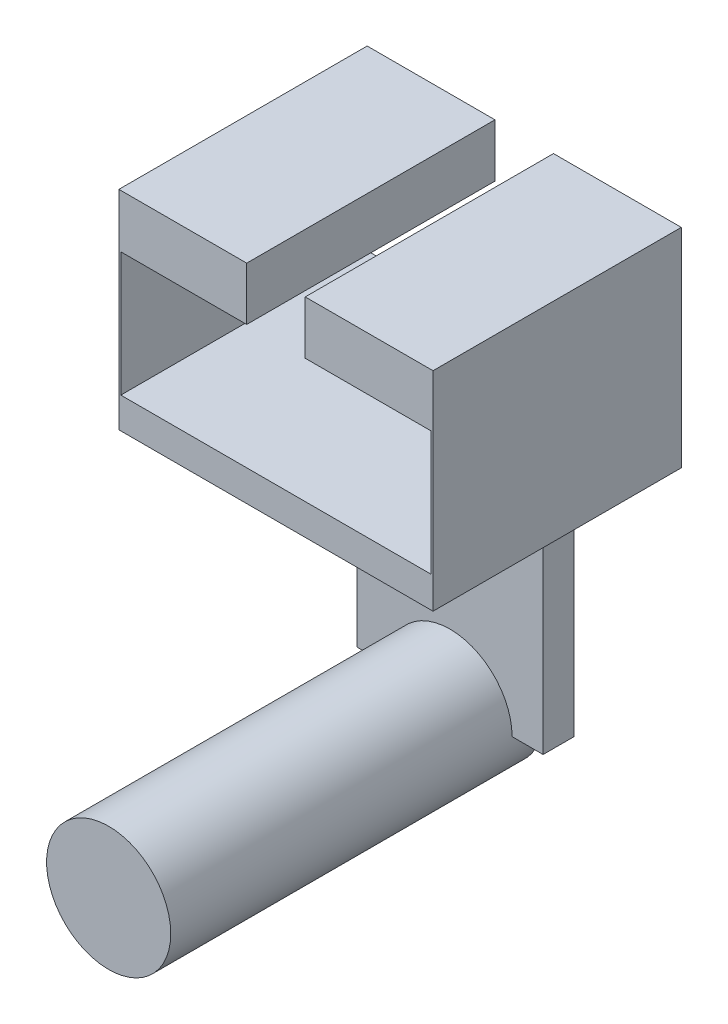
ISO-10303-21;
HEADER;
FILE_DESCRIPTION(('STEP AP214'),'2;1');
FILE_NAME('part.step','',(''),(''),'','','');
FILE_SCHEMA(('AUTOMOTIVE_DESIGN { 1 0 10303 214 1 1 1 1 }'));
ENDSEC;
DATA;
#1=APPLICATION_CONTEXT('core data for automotive mechanical design processes');
#2=APPLICATION_PROTOCOL_DEFINITION('international standard','automotive_design',2000,#1);
#3=PRODUCT_CONTEXT('',#1,'mechanical');
#4=PRODUCT('Part','Part','',(#3));
#5=PRODUCT_RELATED_PRODUCT_CATEGORY('part','',(#4));
#6=PRODUCT_DEFINITION_FORMATION('','',#4);
#7=PRODUCT_DEFINITION_CONTEXT('part definition',#1,'design');
#8=PRODUCT_DEFINITION('design','',#6,#7);
#9=PRODUCT_DEFINITION_SHAPE('','',#8);
#10=(LENGTH_UNIT() NAMED_UNIT(*) SI_UNIT(.MILLI.,.METRE.));
#11=(NAMED_UNIT(*) PLANE_ANGLE_UNIT() SI_UNIT($,.RADIAN.));
#12=(NAMED_UNIT(*) SI_UNIT($,.STERADIAN.) SOLID_ANGLE_UNIT());
#13=UNCERTAINTY_MEASURE_WITH_UNIT(LENGTH_MEASURE(1.E-05),#10,'distance_accuracy_value','');
#14=(GEOMETRIC_REPRESENTATION_CONTEXT(3) GLOBAL_UNCERTAINTY_ASSIGNED_CONTEXT((#13)) GLOBAL_UNIT_ASSIGNED_CONTEXT((#10,
#11,#12)) REPRESENTATION_CONTEXT('',''));
#15=CARTESIAN_POINT('',(0.,0.,0.));
#16=DIRECTION('',(0.,0.,1.));
#17=DIRECTION('',(1.,0.,0.));
#18=AXIS2_PLACEMENT_3D('',#15,#16,#17);
#19=CARTESIAN_POINT('',(32.7980582503673,82.55,-7.78651726081213));
#20=DIRECTION('',(1.,0.,0.));
#21=DIRECTION('',(0.,1.,0.));
#22=AXIS2_PLACEMENT_3D('',#19,#20,#21);
#23=PLANE('',#22);
#24=DIRECTION('',(0.,0.,1.));
#25=VECTOR('',#24,1.);
#26=CARTESIAN_POINT('',(32.7980582503673,82.55,-7.78651726081213));
#27=LINE('',#26,#25);
#28=CARTESIAN_POINT('',(32.7980582503673,82.55,-7.78651726081213));
#29=VERTEX_POINT('',#28);
#30=CARTESIAN_POINT('',(32.7980582503673,82.55,43.0134827391879));
#31=VERTEX_POINT('',#30);
#32=EDGE_CURVE('E62',#29,#31,#27,.T.);
#33=ORIENTED_EDGE('',*,*,#32,.F.);
#34=DIRECTION('',(0.,-1.,0.));
#35=VECTOR('',#34,1.);
#36=CARTESIAN_POINT('',(32.7980582503673,82.55,-7.78651726081213));
#37=LINE('',#36,#35);
#38=CARTESIAN_POINT('',(32.7980582503673,57.15,-7.78651726081213));
#39=VERTEX_POINT('',#38);
#40=EDGE_CURVE('E193',#29,#39,#37,.T.);
#41=ORIENTED_EDGE('',*,*,#40,.T.);
#42=DIRECTION('',(0.,0.,1.));
#43=VECTOR('',#42,1.);
#44=CARTESIAN_POINT('',(32.7980582503673,57.15,-7.78651726081213));
#45=LINE('',#44,#43);
#46=CARTESIAN_POINT('',(32.7980582503673,57.15,43.0134827391879));
#47=VERTEX_POINT('',#46);
#48=EDGE_CURVE('E269',#39,#47,#45,.T.);
#49=ORIENTED_EDGE('',*,*,#48,.T.);
#50=DIRECTION('',(0.,-1.,0.));
#51=VECTOR('',#50,1.);
#52=CARTESIAN_POINT('',(32.7980582503673,82.55,43.0134827391879));
#53=LINE('',#52,#51);
#54=EDGE_CURVE('E277',#31,#47,#53,.T.);
#55=ORIENTED_EDGE('',*,*,#54,.F.);
#56=EDGE_LOOP('',(#33,#41,#49,#55));
#57=FACE_BOUND('',#56,.T.);
#58=ADVANCED_FACE('F44',(#57),#23,.F.);
#59=CARTESIAN_POINT('',(-30.7019417496327,82.55,-7.78651726081213));
#60=DIRECTION('',(-1.,0.,0.));
#61=DIRECTION('',(0.,-1.,0.));
#62=AXIS2_PLACEMENT_3D('',#59,#60,#61);
#63=PLANE('',#62);
#64=DIRECTION('',(0.,0.,-1.));
#65=VECTOR('',#64,1.);
#66=CARTESIAN_POINT('',(-30.7019417496326,82.55,43.0134827391879));
#67=LINE('',#66,#65);
#68=CARTESIAN_POINT('',(-30.7019417496326,82.55,43.0134827391879));
#69=VERTEX_POINT('',#68);
#70=CARTESIAN_POINT('',(-30.7019417496327,82.55,-7.78651726081213));
#71=VERTEX_POINT('',#70);
#72=EDGE_CURVE('E66',#69,#71,#67,.T.);
#73=ORIENTED_EDGE('',*,*,#72,.F.);
#74=DIRECTION('',(0.,-1.,0.));
#75=VECTOR('',#74,1.);
#76=CARTESIAN_POINT('',(-30.7019417496326,82.55,43.0134827391879));
#77=LINE('',#76,#75);
#78=CARTESIAN_POINT('',(-30.7019417496326,57.15,43.0134827391879));
#79=VERTEX_POINT('',#78);
#80=EDGE_CURVE('E258',#69,#79,#77,.T.);
#81=ORIENTED_EDGE('',*,*,#80,.T.);
#82=DIRECTION('',(0.,0.,-1.));
#83=VECTOR('',#82,1.);
#84=CARTESIAN_POINT('',(-30.7019417496327,57.15,-7.78651726081213));
#85=LINE('',#84,#83);
#86=CARTESIAN_POINT('',(-30.7019417496327,57.15,-7.78651726081213));
#87=VERTEX_POINT('',#86);
#88=EDGE_CURVE('E246',#79,#87,#85,.T.);
#89=ORIENTED_EDGE('',*,*,#88,.T.);
#90=DIRECTION('',(0.,-1.,0.));
#91=VECTOR('',#90,1.);
#92=CARTESIAN_POINT('',(-30.7019417496327,82.55,-7.78651726081213));
#93=LINE('',#92,#91);
#94=EDGE_CURVE('E251',#71,#87,#93,.T.);
#95=ORIENTED_EDGE('',*,*,#94,.F.);
#96=EDGE_LOOP('',(#73,#81,#89,#95));
#97=FACE_BOUND('',#96,.T.);
#98=ADVANCED_FACE('F403',(#97),#63,.F.);
#99=CARTESIAN_POINT('',(0.,0.,76.2));
#100=DIRECTION('',(0.,0.,-1.));
#101=DIRECTION('',(-1.,0.,0.));
#102=AXIS2_PLACEMENT_3D('',#99,#100,#101);
#103=CYLINDRICAL_SURFACE('',#102,12.7);
#104=CARTESIAN_POINT('',(0.,0.,76.2));
#105=DIRECTION('',(0.,0.,1.));
#106=DIRECTION('',(1.,0.,0.));
#107=AXIS2_PLACEMENT_3D('',#104,#105,#106);
#108=CIRCLE('',#107,12.7);
#109=CARTESIAN_POINT('',(12.7,0.,76.2));
#110=VERTEX_POINT('',#109);
#111=EDGE_CURVE('E355',#110,#110,#108,.T.);
#112=ORIENTED_EDGE('',*,*,#111,.F.);
#113=EDGE_LOOP('',(#112));
#114=FACE_BOUND('',#113,.T.);
#115=CARTESIAN_POINT('',(0.,0.,6.34999999999999));
#116=DIRECTION('',(0.,0.,-1.));
#117=DIRECTION('',(-1.,0.,0.));
#118=AXIS2_PLACEMENT_3D('',#115,#116,#117);
#119=CIRCLE('',#118,12.7);
#120=CARTESIAN_POINT('',(-12.7,0.,6.34999999999999));
#121=VERTEX_POINT('',#120);
#122=CARTESIAN_POINT('',(12.7,0.,6.34999999999999));
#123=VERTEX_POINT('',#122);
#124=EDGE_CURVE('E359',#121,#123,#119,.T.);
#125=ORIENTED_EDGE('',*,*,#124,.F.);
#126=DIRECTION('',(0.,0.,-1.));
#127=VECTOR('',#126,1.);
#128=CARTESIAN_POINT('',(-12.7,0.,76.2));
#129=LINE('',#128,#127);
#130=CARTESIAN_POINT('',(-12.7,0.,0.));
#131=VERTEX_POINT('',#130);
#132=EDGE_CURVE('E11',#121,#131,#129,.T.);
#133=ORIENTED_EDGE('',*,*,#132,.T.);
#134=CARTESIAN_POINT('',(0.,0.,0.));
#135=DIRECTION('',(0.,0.,1.));
#136=DIRECTION('',(1.,0.,0.));
#137=AXIS2_PLACEMENT_3D('',#134,#135,#136);
#138=CIRCLE('',#137,12.7);
#139=CARTESIAN_POINT('',(12.7,0.,0.));
#140=VERTEX_POINT('',#139);
#141=EDGE_CURVE('E342',#131,#140,#138,.T.);
#142=ORIENTED_EDGE('',*,*,#141,.T.);
#143=DIRECTION('',(0.,0.,-1.));
#144=VECTOR('',#143,1.);
#145=CARTESIAN_POINT('',(12.7,0.,76.2));
#146=LINE('',#145,#144);
#147=EDGE_CURVE('E53',#140,#123,#146,.F.);
#148=ORIENTED_EDGE('',*,*,#147,.T.);
#149=EDGE_LOOP('',(#125,#133,#142,#148));
#150=FACE_BOUND('',#149,.T.);
#151=ADVANCED_FACE('F50',(#114,#150),#103,.T.);
#152=CARTESIAN_POINT('',(0.,0.,76.2));
#153=DIRECTION('',(0.,0.,1.));
#154=DIRECTION('',(1.,0.,0.));
#155=AXIS2_PLACEMENT_3D('',#152,#153,#154);
#156=PLANE('',#155);
#157=ORIENTED_EDGE('',*,*,#111,.T.);
#158=EDGE_LOOP('',(#157));
#159=FACE_BOUND('',#158,.T.);
#160=ADVANCED_FACE('F402',(#159),#156,.T.);
#161=CARTESIAN_POINT('',(0.,0.,0.));
#162=DIRECTION('',(0.,0.,1.));
#163=DIRECTION('',(1.,0.,0.));
#164=AXIS2_PLACEMENT_3D('',#161,#162,#163);
#165=PLANE('',#164);
#166=ORIENTED_EDGE('',*,*,#141,.F.);
#167=DIRECTION('',(-1.,0.,0.));
#168=VECTOR('',#167,1.);
#169=CARTESIAN_POINT('',(0.,0.,0.));
#170=LINE('',#169,#168);
#171=CARTESIAN_POINT('',(-19.05,0.,0.));
#172=VERTEX_POINT('',#171);
#173=EDGE_CURVE('E329',#131,#172,#170,.T.);
#174=ORIENTED_EDGE('',*,*,#173,.T.);
#175=DIRECTION('',(0.,1.,0.));
#176=VECTOR('',#175,1.);
#177=CARTESIAN_POINT('',(-19.05,0.,0.));
#178=LINE('',#177,#176);
#179=CARTESIAN_POINT('',(-19.05,50.8,0.));
#180=VERTEX_POINT('',#179);
#181=EDGE_CURVE('E309',#172,#180,#178,.T.);
#182=ORIENTED_EDGE('',*,*,#181,.T.);
#183=DIRECTION('',(1.,0.,0.));
#184=VECTOR('',#183,1.);
#185=CARTESIAN_POINT('',(-19.05,50.8,0.));
#186=LINE('',#185,#184);
#187=CARTESIAN_POINT('',(19.05,50.8,0.));
#188=VERTEX_POINT('',#187);
#189=EDGE_CURVE('E298',#180,#188,#186,.T.);
#190=ORIENTED_EDGE('',*,*,#189,.T.);
#191=DIRECTION('',(0.,-1.,0.));
#192=VECTOR('',#191,1.);
#193=CARTESIAN_POINT('',(19.05,50.8,0.));
#194=LINE('',#193,#192);
#195=CARTESIAN_POINT('',(19.05,0.,0.));
#196=VERTEX_POINT('',#195);
#197=EDGE_CURVE('E326',#188,#196,#194,.T.);
#198=ORIENTED_EDGE('',*,*,#197,.T.);
#199=EDGE_CURVE('E332',#196,#140,#170,.T.);
#200=ORIENTED_EDGE('',*,*,#199,.T.);
#201=EDGE_LOOP('',(#166,#174,#182,#190,#198,#200));
#202=FACE_BOUND('',#201,.T.);
#203=ADVANCED_FACE('F377',(#202),#165,.F.);
#204=CARTESIAN_POINT('',(0.,0.,6.35));
#205=DIRECTION('',(0.,-1.,0.));
#206=DIRECTION('',(0.,0.,-1.));
#207=AXIS2_PLACEMENT_3D('',#204,#205,#206);
#208=PLANE('',#207);
#209=ORIENTED_EDGE('',*,*,#132,.F.);
#210=DIRECTION('',(-1.,0.,0.));
#211=VECTOR('',#210,1.);
#212=CARTESIAN_POINT('',(19.05,0.,6.35));
#213=LINE('',#212,#211);
#214=CARTESIAN_POINT('',(-19.05,0.,6.35));
#215=VERTEX_POINT('',#214);
#216=EDGE_CURVE('E314',#121,#215,#213,.T.);
#217=ORIENTED_EDGE('',*,*,#216,.T.);
#218=DIRECTION('',(0.,0.,-1.));
#219=VECTOR('',#218,1.);
#220=CARTESIAN_POINT('',(-19.05,0.,6.35));
#221=LINE('',#220,#219);
#222=EDGE_CURVE('E344',#215,#172,#221,.T.);
#223=ORIENTED_EDGE('',*,*,#222,.T.);
#224=ORIENTED_EDGE('',*,*,#173,.F.);
#225=EDGE_LOOP('',(#209,#217,#223,#224));
#226=FACE_BOUND('',#225,.T.);
#227=ADVANCED_FACE('F392',(#226),#208,.T.);
#228=ORIENTED_EDGE('',*,*,#147,.F.);
#229=ORIENTED_EDGE('',*,*,#199,.F.);
#230=DIRECTION('',(0.,0.,-1.));
#231=VECTOR('',#230,1.);
#232=CARTESIAN_POINT('',(19.05,0.,6.35));
#233=LINE('',#232,#231);
#234=CARTESIAN_POINT('',(19.05,0.,6.35));
#235=VERTEX_POINT('',#234);
#236=EDGE_CURVE('E347',#235,#196,#233,.T.);
#237=ORIENTED_EDGE('',*,*,#236,.F.);
#238=EDGE_CURVE('E312',#235,#123,#213,.T.);
#239=ORIENTED_EDGE('',*,*,#238,.T.);
#240=EDGE_LOOP('',(#228,#229,#237,#239));
#241=FACE_BOUND('',#240,.T.);
#242=ADVANCED_FACE('F372',(#241),#208,.T.);
#243=CARTESIAN_POINT('',(-19.05,0.,6.35));
#244=DIRECTION('',(-1.,0.,0.));
#245=DIRECTION('',(0.,0.,1.));
#246=AXIS2_PLACEMENT_3D('',#243,#244,#245);
#247=PLANE('',#246);
#248=ORIENTED_EDGE('',*,*,#181,.F.);
#249=ORIENTED_EDGE('',*,*,#222,.F.);
#250=DIRECTION('',(0.,1.,0.));
#251=VECTOR('',#250,1.);
#252=CARTESIAN_POINT('',(-19.05,0.,6.35));
#253=LINE('',#252,#251);
#254=CARTESIAN_POINT('',(-19.05,50.8,6.35));
#255=VERTEX_POINT('',#254);
#256=EDGE_CURVE('E317',#215,#255,#253,.T.);
#257=ORIENTED_EDGE('',*,*,#256,.T.);
#258=DIRECTION('',(0.,0.,-1.));
#259=VECTOR('',#258,1.);
#260=CARTESIAN_POINT('',(-19.05,50.8,6.35));
#261=LINE('',#260,#259);
#262=EDGE_CURVE('E340',#255,#180,#261,.T.);
#263=ORIENTED_EDGE('',*,*,#262,.T.);
#264=EDGE_LOOP('',(#248,#249,#257,#263));
#265=FACE_BOUND('',#264,.T.);
#266=ADVANCED_FACE('F389',(#265),#247,.T.);
#267=CARTESIAN_POINT('',(19.05,50.8,6.35));
#268=DIRECTION('',(1.,0.,0.));
#269=DIRECTION('',(0.,1.,0.));
#270=AXIS2_PLACEMENT_3D('',#267,#268,#269);
#271=PLANE('',#270);
#272=ORIENTED_EDGE('',*,*,#197,.F.);
#273=DIRECTION('',(0.,0.,-1.));
#274=VECTOR('',#273,1.);
#275=CARTESIAN_POINT('',(19.05,50.8,6.35));
#276=LINE('',#275,#274);
#277=CARTESIAN_POINT('',(19.05,50.8,6.35));
#278=VERTEX_POINT('',#277);
#279=EDGE_CURVE('E323',#278,#188,#276,.T.);
#280=ORIENTED_EDGE('',*,*,#279,.F.);
#281=DIRECTION('',(0.,-1.,0.));
#282=VECTOR('',#281,1.);
#283=CARTESIAN_POINT('',(19.05,50.8,6.35));
#284=LINE('',#283,#282);
#285=EDGE_CURVE('E310',#278,#235,#284,.T.);
#286=ORIENTED_EDGE('',*,*,#285,.T.);
#287=ORIENTED_EDGE('',*,*,#236,.T.);
#288=EDGE_LOOP('',(#272,#280,#286,#287));
#289=FACE_BOUND('',#288,.T.);
#290=ADVANCED_FACE('F380',(#289),#271,.T.);
#291=CARTESIAN_POINT('',(0.,0.,6.35));
#292=DIRECTION('',(0.,0.,-1.));
#293=DIRECTION('',(-1.,0.,0.));
#294=AXIS2_PLACEMENT_3D('',#291,#292,#293);
#295=PLANE('',#294);
#296=ORIENTED_EDGE('',*,*,#216,.F.);
#297=ORIENTED_EDGE('',*,*,#124,.T.);
#298=ORIENTED_EDGE('',*,*,#238,.F.);
#299=ORIENTED_EDGE('',*,*,#285,.F.);
#300=DIRECTION('',(1.,0.,0.));
#301=VECTOR('',#300,1.);
#302=CARTESIAN_POINT('',(-19.05,50.8,6.35));
#303=LINE('',#302,#301);
#304=EDGE_CURVE('E303',#255,#278,#303,.T.);
#305=ORIENTED_EDGE('',*,*,#304,.F.);
#306=ORIENTED_EDGE('',*,*,#256,.F.);
#307=EDGE_LOOP('',(#296,#297,#298,#299,#305,#306));
#308=FACE_BOUND('',#307,.T.);
#309=ADVANCED_FACE('F371',(#308),#295,.F.);
#310=CARTESIAN_POINT('',(-30.7019417496327,57.15,43.0134827391879));
#311=DIRECTION('',(0.,0.,-1.));
#312=DIRECTION('',(-1.,0.,0.));
#313=AXIS2_PLACEMENT_3D('',#310,#311,#312);
#314=PLANE('',#313);
#315=DIRECTION('',(1.,0.,0.));
#316=VECTOR('',#315,1.);
#317=CARTESIAN_POINT('',(-30.7019417496327,50.8,43.0134827391879));
#318=LINE('',#317,#316);
#319=CARTESIAN_POINT('',(-31.0905617496327,50.8,43.0134827391879));
#320=VERTEX_POINT('',#319);
#321=CARTESIAN_POINT('',(33.1866782503673,50.8,43.0134827391879));
#322=VERTEX_POINT('',#321);
#323=EDGE_CURVE('E288',#320,#322,#318,.T.);
#324=ORIENTED_EDGE('',*,*,#323,.T.);
#325=DIRECTION('',(0.,-1.,0.));
#326=VECTOR('',#325,1.);
#327=CARTESIAN_POINT('',(33.1866782503673,57.15,43.0134827391879));
#328=LINE('',#327,#326);
#329=CARTESIAN_POINT('',(33.1866782503674,93.4212,43.0134827391879));
#330=VERTEX_POINT('',#329);
#331=EDGE_CURVE('E276',#330,#322,#328,.T.);
#332=ORIENTED_EDGE('',*,*,#331,.F.);
#333=DIRECTION('',(1.,0.,0.));
#334=VECTOR('',#333,1.);
#335=CARTESIAN_POINT('',(32.7980582503673,93.4212,43.0134827391879));
#336=LINE('',#335,#334);
#337=CARTESIAN_POINT('',(7.03483825036735,93.4212,43.0134827391879));
#338=VERTEX_POINT('',#337);
#339=EDGE_CURVE('E197',#338,#330,#336,.T.);
#340=ORIENTED_EDGE('',*,*,#339,.F.);
#341=DIRECTION('',(0.,1.,0.));
#342=VECTOR('',#341,1.);
#343=CARTESIAN_POINT('',(7.03483825036735,93.4212,43.0134827391879));
#344=LINE('',#343,#342);
#345=CARTESIAN_POINT('',(7.03483825036735,82.55,43.0134827391879));
#346=VERTEX_POINT('',#345);
#347=EDGE_CURVE('E182',#346,#338,#344,.T.);
#348=ORIENTED_EDGE('',*,*,#347,.F.);
#349=DIRECTION('',(1.,0.,0.));
#350=VECTOR('',#349,1.);
#351=CARTESIAN_POINT('',(7.03483825036735,82.55,43.0134827391879));
#352=LINE('',#351,#350);
#353=EDGE_CURVE('E177',#346,#31,#352,.T.);
#354=ORIENTED_EDGE('',*,*,#353,.T.);
#355=ORIENTED_EDGE('',*,*,#54,.T.);
#356=DIRECTION('',(1.,0.,0.));
#357=VECTOR('',#356,1.);
#358=CARTESIAN_POINT('',(-30.7019417496327,57.15,43.0134827391879));
#359=LINE('',#358,#357);
#360=EDGE_CURVE('E292',#79,#47,#359,.T.);
#361=ORIENTED_EDGE('',*,*,#360,.F.);
#362=ORIENTED_EDGE('',*,*,#80,.F.);
#363=DIRECTION('',(-1.,0.,0.));
#364=VECTOR('',#363,1.);
#365=CARTESIAN_POINT('',(-4.93872174963264,82.55,43.0134827391879));
#366=LINE('',#365,#364);
#367=CARTESIAN_POINT('',(-4.93872174963264,82.55,43.0134827391879));
#368=VERTEX_POINT('',#367);
#369=EDGE_CURVE('E231',#368,#69,#366,.T.);
#370=ORIENTED_EDGE('',*,*,#369,.F.);
#371=DIRECTION('',(0.,-1.,0.));
#372=VECTOR('',#371,1.);
#373=CARTESIAN_POINT('',(-4.93872174963264,93.4212,43.0134827391879));
#374=LINE('',#373,#372);
#375=CARTESIAN_POINT('',(-4.93872174963264,93.4212,43.0134827391879));
#376=VERTEX_POINT('',#375);
#377=EDGE_CURVE('E213',#376,#368,#374,.T.);
#378=ORIENTED_EDGE('',*,*,#377,.F.);
#379=DIRECTION('',(1.,0.,0.));
#380=VECTOR('',#379,1.);
#381=CARTESIAN_POINT('',(-31.0905617496326,93.4212,43.0134827391879));
#382=LINE('',#381,#380);
#383=CARTESIAN_POINT('',(-31.0905617496326,93.4212,43.0134827391879));
#384=VERTEX_POINT('',#383);
#385=EDGE_CURVE('E244',#384,#376,#382,.T.);
#386=ORIENTED_EDGE('',*,*,#385,.F.);
#387=DIRECTION('',(0.,1.,0.));
#388=VECTOR('',#387,1.);
#389=CARTESIAN_POINT('',(-31.0905617496327,57.15,43.0134827391879));
#390=LINE('',#389,#388);
#391=EDGE_CURVE('E270',#320,#384,#390,.T.);
#392=ORIENTED_EDGE('',*,*,#391,.F.);
#393=EDGE_LOOP('',(#324,#332,#340,#348,#354,#355,#361,#362,#370,#378,#386,#392));
#394=FACE_BOUND('',#393,.T.);
#395=ADVANCED_FACE('F430',(#394),#314,.F.);
#396=CARTESIAN_POINT('',(-30.7019417496327,57.15,-7.78651726081213));
#397=DIRECTION('',(0.,0.,1.));
#398=DIRECTION('',(1.,0.,0.));
#399=AXIS2_PLACEMENT_3D('',#396,#397,#398);
#400=PLANE('',#399);
#401=DIRECTION('',(-1.,0.,0.));
#402=VECTOR('',#401,1.);
#403=CARTESIAN_POINT('',(-30.7019417496327,50.8,-7.78651726081213));
#404=LINE('',#403,#402);
#405=CARTESIAN_POINT('',(33.1866782503673,50.8,-7.78651726081213));
#406=VERTEX_POINT('',#405);
#407=CARTESIAN_POINT('',(-31.0905617496327,50.8,-7.78651726081213));
#408=VERTEX_POINT('',#407);
#409=EDGE_CURVE('E297',#406,#408,#404,.T.);
#410=ORIENTED_EDGE('',*,*,#409,.T.);
#411=DIRECTION('',(0.,-1.,0.));
#412=VECTOR('',#411,1.);
#413=CARTESIAN_POINT('',(-31.0905617496327,57.15,-7.78651726081213));
#414=LINE('',#413,#412);
#415=CARTESIAN_POINT('',(-31.0905617496326,93.4212,-7.78651726081213));
#416=VERTEX_POINT('',#415);
#417=EDGE_CURVE('E259',#416,#408,#414,.T.);
#418=ORIENTED_EDGE('',*,*,#417,.F.);
#419=DIRECTION('',(-1.,0.,0.));
#420=VECTOR('',#419,1.);
#421=CARTESIAN_POINT('',(-31.0905617496326,93.4212,-7.78651726081213));
#422=LINE('',#421,#420);
#423=CARTESIAN_POINT('',(-4.93872174963265,93.4212,-7.78651726081213));
#424=VERTEX_POINT('',#423);
#425=EDGE_CURVE('E243',#424,#416,#422,.T.);
#426=ORIENTED_EDGE('',*,*,#425,.F.);
#427=DIRECTION('',(0.,1.,0.));
#428=VECTOR('',#427,1.);
#429=CARTESIAN_POINT('',(-4.93872174963265,93.4212,-7.78651726081213));
#430=LINE('',#429,#428);
#431=CARTESIAN_POINT('',(-4.93872174963265,82.55,-7.78651726081213));
#432=VERTEX_POINT('',#431);
#433=EDGE_CURVE('E219',#432,#424,#430,.T.);
#434=ORIENTED_EDGE('',*,*,#433,.F.);
#435=DIRECTION('',(-1.,0.,0.));
#436=VECTOR('',#435,1.);
#437=CARTESIAN_POINT('',(-4.93872174963265,82.55,-7.78651726081213));
#438=LINE('',#437,#436);
#439=EDGE_CURVE('E230',#432,#71,#438,.T.);
#440=ORIENTED_EDGE('',*,*,#439,.T.);
#441=ORIENTED_EDGE('',*,*,#94,.T.);
#442=DIRECTION('',(-1.,0.,0.));
#443=VECTOR('',#442,1.);
#444=CARTESIAN_POINT('',(-30.7019417496327,57.15,-7.78651726081213));
#445=LINE('',#444,#443);
#446=EDGE_CURVE('E293',#39,#87,#445,.T.);
#447=ORIENTED_EDGE('',*,*,#446,.F.);
#448=ORIENTED_EDGE('',*,*,#40,.F.);
#449=DIRECTION('',(1.,0.,0.));
#450=VECTOR('',#449,1.);
#451=CARTESIAN_POINT('',(7.03483825036735,82.55,-7.78651726081213));
#452=LINE('',#451,#450);
#453=CARTESIAN_POINT('',(7.03483825036735,82.55,-7.78651726081213));
#454=VERTEX_POINT('',#453);
#455=EDGE_CURVE('E171',#454,#29,#452,.T.);
#456=ORIENTED_EDGE('',*,*,#455,.F.);
#457=DIRECTION('',(0.,-1.,0.));
#458=VECTOR('',#457,1.);
#459=CARTESIAN_POINT('',(7.03483825036735,93.4212,-7.78651726081213));
#460=LINE('',#459,#458);
#461=CARTESIAN_POINT('',(7.03483825036735,93.4212,-7.78651726081213));
#462=VERTEX_POINT('',#461);
#463=EDGE_CURVE('E185',#462,#454,#460,.T.);
#464=ORIENTED_EDGE('',*,*,#463,.F.);
#465=DIRECTION('',(-1.,0.,0.));
#466=VECTOR('',#465,1.);
#467=CARTESIAN_POINT('',(32.7980582503673,93.4212,-7.78651726081213));
#468=LINE('',#467,#466);
#469=CARTESIAN_POINT('',(33.1866782503674,93.4212,-7.78651726081213));
#470=VERTEX_POINT('',#469);
#471=EDGE_CURVE('E209',#470,#462,#468,.T.);
#472=ORIENTED_EDGE('',*,*,#471,.F.);
#473=DIRECTION('',(0.,1.,0.));
#474=VECTOR('',#473,1.);
#475=CARTESIAN_POINT('',(33.1866782503673,57.15,-7.78651726081213));
#476=LINE('',#475,#474);
#477=EDGE_CURVE('E289',#406,#470,#476,.T.);
#478=ORIENTED_EDGE('',*,*,#477,.F.);
#479=EDGE_LOOP('',(#410,#418,#426,#434,#440,#441,#447,#448,#456,#464,#472,#478));
#480=FACE_BOUND('',#479,.T.);
#481=ADVANCED_FACE('F195',(#480),#400,.F.);
#482=CARTESIAN_POINT('',(0.,57.15,0.));
#483=DIRECTION('',(0.,1.,0.));
#484=DIRECTION('',(-1.,0.,0.));
#485=AXIS2_PLACEMENT_3D('',#482,#483,#484);
#486=PLANE('',#485);
#487=ORIENTED_EDGE('',*,*,#88,.F.);
#488=ORIENTED_EDGE('',*,*,#360,.T.);
#489=ORIENTED_EDGE('',*,*,#48,.F.);
#490=ORIENTED_EDGE('',*,*,#446,.T.);
#491=EDGE_LOOP('',(#487,#488,#489,#490));
#492=FACE_BOUND('',#491,.T.);
#493=ADVANCED_FACE('F420',(#492),#486,.T.);
#494=CARTESIAN_POINT('',(0.,50.8,0.));
#495=DIRECTION('',(0.,1.,0.));
#496=DIRECTION('',(-1.,0.,0.));
#497=AXIS2_PLACEMENT_3D('',#494,#495,#496);
#498=PLANE('',#497);
#499=ORIENTED_EDGE('',*,*,#189,.F.);
#500=ORIENTED_EDGE('',*,*,#262,.F.);
#501=ORIENTED_EDGE('',*,*,#304,.T.);
#502=ORIENTED_EDGE('',*,*,#279,.T.);
#503=EDGE_LOOP('',(#499,#500,#501,#502));
#504=FACE_BOUND('',#503,.T.);
#505=ORIENTED_EDGE('',*,*,#323,.F.);
#506=DIRECTION('',(0.,0.,1.));
#507=VECTOR('',#506,1.);
#508=CARTESIAN_POINT('',(-31.0905617496327,50.8,-7.78651726081213));
#509=LINE('',#508,#507);
#510=EDGE_CURVE('E263',#408,#320,#509,.T.);
#511=ORIENTED_EDGE('',*,*,#510,.F.);
#512=ORIENTED_EDGE('',*,*,#409,.F.);
#513=DIRECTION('',(0.,0.,-1.));
#514=VECTOR('',#513,1.);
#515=CARTESIAN_POINT('',(33.1866782503673,50.8,43.0134827391879));
#516=LINE('',#515,#514);
#517=EDGE_CURVE('E285',#322,#406,#516,.T.);
#518=ORIENTED_EDGE('',*,*,#517,.F.);
#519=EDGE_LOOP('',(#505,#511,#512,#518));
#520=FACE_BOUND('',#519,.T.);
#521=ADVANCED_FACE('F383',(#504,#520),#498,.F.);
#522=CARTESIAN_POINT('',(33.1866782503673,0.,0.));
#523=DIRECTION('',(1.,0.,0.));
#524=DIRECTION('',(0.,0.,-1.));
#525=AXIS2_PLACEMENT_3D('',#522,#523,#524);
#526=PLANE('',#525);
#527=ORIENTED_EDGE('',*,*,#331,.T.);
#528=ORIENTED_EDGE('',*,*,#517,.T.);
#529=ORIENTED_EDGE('',*,*,#477,.T.);
#530=DIRECTION('',(0.,0.,-1.));
#531=VECTOR('',#530,1.);
#532=CARTESIAN_POINT('',(33.1866782503674,93.4212,-7.78651726081213));
#533=LINE('',#532,#531);
#534=EDGE_CURVE('E205',#330,#470,#533,.T.);
#535=ORIENTED_EDGE('',*,*,#534,.F.);
#536=EDGE_LOOP('',(#527,#528,#529,#535));
#537=FACE_BOUND('',#536,.T.);
#538=ADVANCED_FACE('F418',(#537),#526,.T.);
#539=CARTESIAN_POINT('',(-31.0905617496327,0.,0.));
#540=DIRECTION('',(-1.,0.,0.));
#541=DIRECTION('',(0.,0.,1.));
#542=AXIS2_PLACEMENT_3D('',#539,#540,#541);
#543=PLANE('',#542);
#544=ORIENTED_EDGE('',*,*,#417,.T.);
#545=ORIENTED_EDGE('',*,*,#510,.T.);
#546=ORIENTED_EDGE('',*,*,#391,.T.);
#547=DIRECTION('',(0.,0.,1.));
#548=VECTOR('',#547,1.);
#549=CARTESIAN_POINT('',(-31.0905617496326,93.4212,-7.78651726081213));
#550=LINE('',#549,#548);
#551=EDGE_CURVE('E236',#416,#384,#550,.T.);
#552=ORIENTED_EDGE('',*,*,#551,.F.);
#553=EDGE_LOOP('',(#544,#545,#546,#552));
#554=FACE_BOUND('',#553,.T.);
#555=ADVANCED_FACE('F413',(#554),#543,.T.);
#556=CARTESIAN_POINT('',(0.,93.4212,0.));
#557=DIRECTION('',(0.,1.,0.));
#558=DIRECTION('',(0.,0.,1.));
#559=AXIS2_PLACEMENT_3D('',#556,#557,#558);
#560=PLANE('',#559);
#561=ORIENTED_EDGE('',*,*,#551,.T.);
#562=ORIENTED_EDGE('',*,*,#385,.T.);
#563=DIRECTION('',(0.,0.,1.));
#564=VECTOR('',#563,1.);
#565=CARTESIAN_POINT('',(-4.93872174963264,93.4212,43.0134827391879));
#566=LINE('',#565,#564);
#567=EDGE_CURVE('E221',#424,#376,#566,.T.);
#568=ORIENTED_EDGE('',*,*,#567,.F.);
#569=ORIENTED_EDGE('',*,*,#425,.T.);
#570=EDGE_LOOP('',(#561,#562,#568,#569));
#571=FACE_BOUND('',#570,.T.);
#572=ADVANCED_FACE('F563',(#571),#560,.T.);
#573=CARTESIAN_POINT('',(-4.93872174963264,82.55,43.0134827391879));
#574=DIRECTION('',(0.,1.,0.));
#575=DIRECTION('',(-1.,0.,0.));
#576=AXIS2_PLACEMENT_3D('',#573,#574,#575);
#577=PLANE('',#576);
#578=ORIENTED_EDGE('',*,*,#72,.T.);
#579=ORIENTED_EDGE('',*,*,#439,.F.);
#580=DIRECTION('',(0.,0.,-1.));
#581=VECTOR('',#580,1.);
#582=CARTESIAN_POINT('',(-4.93872174963264,82.55,43.0134827391879));
#583=LINE('',#582,#581);
#584=EDGE_CURVE('E220',#368,#432,#583,.T.);
#585=ORIENTED_EDGE('',*,*,#584,.F.);
#586=ORIENTED_EDGE('',*,*,#369,.T.);
#587=EDGE_LOOP('',(#578,#579,#585,#586));
#588=FACE_BOUND('',#587,.T.);
#589=ADVANCED_FACE('F578',(#588),#577,.F.);
#590=CARTESIAN_POINT('',(-4.93872174963268,0.,0.));
#591=DIRECTION('',(1.,0.,0.));
#592=DIRECTION('',(0.,1.,0.));
#593=AXIS2_PLACEMENT_3D('',#590,#591,#592);
#594=PLANE('',#593);
#595=ORIENTED_EDGE('',*,*,#377,.T.);
#596=ORIENTED_EDGE('',*,*,#584,.T.);
#597=ORIENTED_EDGE('',*,*,#433,.T.);
#598=ORIENTED_EDGE('',*,*,#567,.T.);
#599=EDGE_LOOP('',(#595,#596,#597,#598));
#600=FACE_BOUND('',#599,.T.);
#601=ADVANCED_FACE('F589',(#600),#594,.T.);
#602=CARTESIAN_POINT('',(0.,93.4212,0.));
#603=DIRECTION('',(0.,1.,0.));
#604=DIRECTION('',(0.,0.,1.));
#605=AXIS2_PLACEMENT_3D('',#602,#603,#604);
#606=PLANE('',#605);
#607=ORIENTED_EDGE('',*,*,#471,.T.);
#608=DIRECTION('',(0.,0.,-1.));
#609=VECTOR('',#608,1.);
#610=CARTESIAN_POINT('',(7.03483825036735,93.4212,-7.78651726081213));
#611=LINE('',#610,#609);
#612=EDGE_CURVE('E190',#338,#462,#611,.T.);
#613=ORIENTED_EDGE('',*,*,#612,.F.);
#614=ORIENTED_EDGE('',*,*,#339,.T.);
#615=ORIENTED_EDGE('',*,*,#534,.T.);
#616=EDGE_LOOP('',(#607,#613,#614,#615));
#617=FACE_BOUND('',#616,.T.);
#618=ADVANCED_FACE('F596',(#617),#606,.T.);
#619=CARTESIAN_POINT('',(7.03483825036735,82.55,-7.78651726081213));
#620=DIRECTION('',(0.,1.,0.));
#621=DIRECTION('',(-1.,0.,0.));
#622=AXIS2_PLACEMENT_3D('',#619,#620,#621);
#623=PLANE('',#622);
#624=ORIENTED_EDGE('',*,*,#32,.T.);
#625=ORIENTED_EDGE('',*,*,#353,.F.);
#626=DIRECTION('',(0.,0.,1.));
#627=VECTOR('',#626,1.);
#628=CARTESIAN_POINT('',(7.03483825036735,82.55,-7.78651726081213));
#629=LINE('',#628,#627);
#630=EDGE_CURVE('E168',#454,#346,#629,.T.);
#631=ORIENTED_EDGE('',*,*,#630,.F.);
#632=ORIENTED_EDGE('',*,*,#455,.T.);
#633=EDGE_LOOP('',(#624,#625,#631,#632));
#634=FACE_BOUND('',#633,.T.);
#635=ADVANCED_FACE('F174',(#634),#623,.F.);
#636=CARTESIAN_POINT('',(7.03483825036735,0.,0.));
#637=DIRECTION('',(-1.,0.,0.));
#638=DIRECTION('',(0.,0.,1.));
#639=AXIS2_PLACEMENT_3D('',#636,#637,#638);
#640=PLANE('',#639);
#641=ORIENTED_EDGE('',*,*,#463,.T.);
#642=ORIENTED_EDGE('',*,*,#630,.T.);
#643=ORIENTED_EDGE('',*,*,#347,.T.);
#644=ORIENTED_EDGE('',*,*,#612,.T.);
#645=EDGE_LOOP('',(#641,#642,#643,#644));
#646=FACE_BOUND('',#645,.T.);
#647=ADVANCED_FACE('F187',(#646),#640,.T.);
#648=CLOSED_SHELL('',(#58,#98,#151,#160,#203,#227,#242,#266,#290,#309,#395,#481,#493,#521,#538,
#555,#572,#589,#601,#618,#635,#647));
#649=MANIFOLD_SOLID_BREP('B2',#648);
#650=ADVANCED_BREP_SHAPE_REPRESENTATION('',(#18,#649),#14);
#651=SHAPE_DEFINITION_REPRESENTATION(#9,#650);
ENDSEC;
END-ISO-10303-21;
